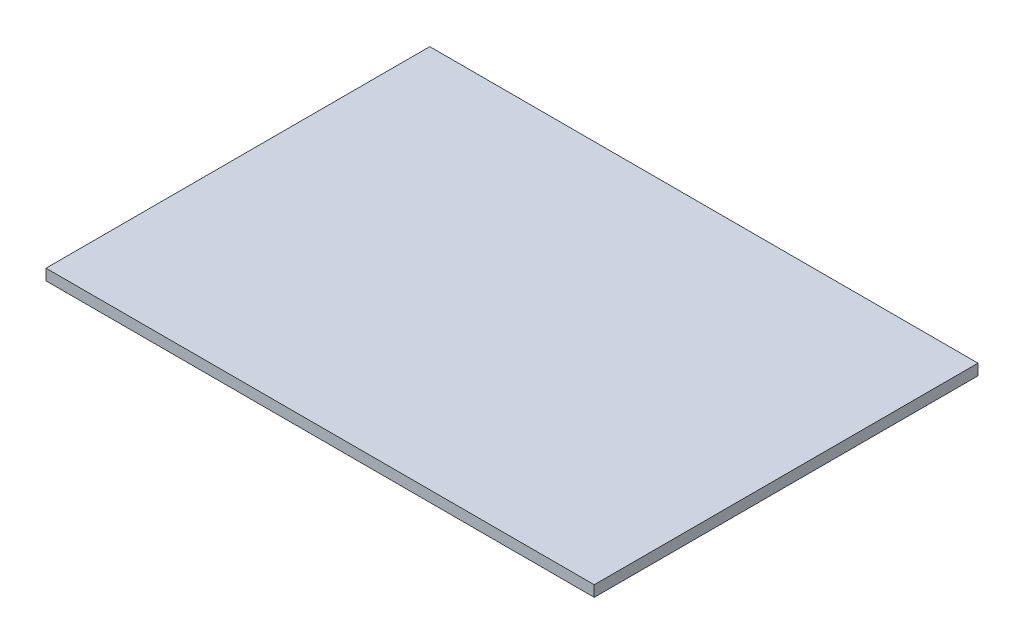
ISO-10303-21;
HEADER;
FILE_DESCRIPTION(('STEP AP214'),'2;1');
FILE_NAME('part.step','',(''),(''),'','','');
FILE_SCHEMA(('AUTOMOTIVE_DESIGN { 1 0 10303 214 1 1 1 1 }'));
ENDSEC;
DATA;
#1=APPLICATION_CONTEXT('core data for automotive mechanical design processes');
#2=APPLICATION_PROTOCOL_DEFINITION('international standard','automotive_design',2000,#1);
#3=PRODUCT_CONTEXT('',#1,'mechanical');
#4=PRODUCT('Part','Part','',(#3));
#5=PRODUCT_RELATED_PRODUCT_CATEGORY('part','',(#4));
#6=PRODUCT_DEFINITION_FORMATION('','',#4);
#7=PRODUCT_DEFINITION_CONTEXT('part definition',#1,'design');
#8=PRODUCT_DEFINITION('design','',#6,#7);
#9=PRODUCT_DEFINITION_SHAPE('','',#8);
#10=(LENGTH_UNIT() NAMED_UNIT(*) SI_UNIT(.MILLI.,.METRE.));
#11=(NAMED_UNIT(*) PLANE_ANGLE_UNIT() SI_UNIT($,.RADIAN.));
#12=(NAMED_UNIT(*) SI_UNIT($,.STERADIAN.) SOLID_ANGLE_UNIT());
#13=UNCERTAINTY_MEASURE_WITH_UNIT(LENGTH_MEASURE(1.E-05),#10,'distance_accuracy_value','');
#14=(GEOMETRIC_REPRESENTATION_CONTEXT(3) GLOBAL_UNCERTAINTY_ASSIGNED_CONTEXT((#13)) GLOBAL_UNIT_ASSIGNED_CONTEXT((#10,
#11,#12)) REPRESENTATION_CONTEXT('',''));
#15=CARTESIAN_POINT('',(0.,0.,0.));
#16=DIRECTION('',(0.,0.,1.));
#17=DIRECTION('',(1.,0.,0.));
#18=AXIS2_PLACEMENT_3D('',#15,#16,#17);
#19=CARTESIAN_POINT('',(-250.,10.,175.));
#20=DIRECTION('',(1.,0.,0.));
#21=DIRECTION('',(0.,0.,-1.));
#22=AXIS2_PLACEMENT_3D('',#19,#20,#21);
#23=PLANE('',#22);
#24=DIRECTION('',(0.,0.,1.));
#25=VECTOR('',#24,1.);
#26=CARTESIAN_POINT('',(-250.,0.,175.));
#27=LINE('',#26,#25);
#28=CARTESIAN_POINT('',(-250.,0.,-175.));
#29=VERTEX_POINT('',#28);
#30=CARTESIAN_POINT('',(-250.,0.,175.));
#31=VERTEX_POINT('',#30);
#32=EDGE_CURVE('E107',#29,#31,#27,.T.);
#33=ORIENTED_EDGE('',*,*,#32,.T.);
#34=DIRECTION('',(0.,-1.,0.));
#35=VECTOR('',#34,1.);
#36=CARTESIAN_POINT('',(-250.,10.,175.));
#37=LINE('',#36,#35);
#38=CARTESIAN_POINT('',(-250.,10.,175.));
#39=VERTEX_POINT('',#38);
#40=EDGE_CURVE('E11',#39,#31,#37,.T.);
#41=ORIENTED_EDGE('',*,*,#40,.F.);
#42=DIRECTION('',(0.,0.,1.));
#43=VECTOR('',#42,1.);
#44=CARTESIAN_POINT('',(-250.,10.,175.));
#45=LINE('',#44,#43);
#46=CARTESIAN_POINT('',(-250.,10.,-175.));
#47=VERTEX_POINT('',#46);
#48=EDGE_CURVE('E91',#47,#39,#45,.T.);
#49=ORIENTED_EDGE('',*,*,#48,.F.);
#50=DIRECTION('',(0.,-1.,0.));
#51=VECTOR('',#50,1.);
#52=CARTESIAN_POINT('',(-250.,10.,-175.));
#53=LINE('',#52,#51);
#54=EDGE_CURVE('E103',#47,#29,#53,.T.);
#55=ORIENTED_EDGE('',*,*,#54,.T.);
#56=EDGE_LOOP('',(#33,#41,#49,#55));
#57=FACE_BOUND('',#56,.T.);
#58=ADVANCED_FACE('F39',(#57),#23,.F.);
#59=CARTESIAN_POINT('',(250.,10.,175.));
#60=DIRECTION('',(0.,0.,-1.));
#61=DIRECTION('',(-1.,0.,0.));
#62=AXIS2_PLACEMENT_3D('',#59,#60,#61);
#63=PLANE('',#62);
#64=DIRECTION('',(1.,0.,0.));
#65=VECTOR('',#64,1.);
#66=CARTESIAN_POINT('',(250.,0.,175.));
#67=LINE('',#66,#65);
#68=CARTESIAN_POINT('',(250.,0.,175.));
#69=VERTEX_POINT('',#68);
#70=EDGE_CURVE('E96',#31,#69,#67,.T.);
#71=ORIENTED_EDGE('',*,*,#70,.T.);
#72=DIRECTION('',(0.,-1.,0.));
#73=VECTOR('',#72,1.);
#74=CARTESIAN_POINT('',(250.,10.,175.));
#75=LINE('',#74,#73);
#76=CARTESIAN_POINT('',(250.,10.,175.));
#77=VERTEX_POINT('',#76);
#78=EDGE_CURVE('E48',#77,#69,#75,.T.);
#79=ORIENTED_EDGE('',*,*,#78,.F.);
#80=DIRECTION('',(1.,0.,0.));
#81=VECTOR('',#80,1.);
#82=CARTESIAN_POINT('',(250.,10.,175.));
#83=LINE('',#82,#81);
#84=EDGE_CURVE('E86',#39,#77,#83,.T.);
#85=ORIENTED_EDGE('',*,*,#84,.F.);
#86=ORIENTED_EDGE('',*,*,#40,.T.);
#87=EDGE_LOOP('',(#71,#79,#85,#86));
#88=FACE_BOUND('',#87,.T.);
#89=ADVANCED_FACE('F95',(#88),#63,.F.);
#90=CARTESIAN_POINT('',(250.,10.,175.));
#91=DIRECTION('',(-1.,0.,0.));
#92=DIRECTION('',(0.,0.,1.));
#93=AXIS2_PLACEMENT_3D('',#90,#91,#92);
#94=PLANE('',#93);
#95=DIRECTION('',(0.,0.,-1.));
#96=VECTOR('',#95,1.);
#97=CARTESIAN_POINT('',(250.,0.,175.));
#98=LINE('',#97,#96);
#99=CARTESIAN_POINT('',(250.,0.,-175.));
#100=VERTEX_POINT('',#99);
#101=EDGE_CURVE('E73',#69,#100,#98,.T.);
#102=ORIENTED_EDGE('',*,*,#101,.T.);
#103=DIRECTION('',(0.,-1.,0.));
#104=VECTOR('',#103,1.);
#105=CARTESIAN_POINT('',(250.,10.,-175.));
#106=LINE('',#105,#104);
#107=CARTESIAN_POINT('',(250.,10.,-175.));
#108=VERTEX_POINT('',#107);
#109=EDGE_CURVE('E98',#108,#100,#106,.T.);
#110=ORIENTED_EDGE('',*,*,#109,.F.);
#111=DIRECTION('',(0.,0.,-1.));
#112=VECTOR('',#111,1.);
#113=CARTESIAN_POINT('',(250.,10.,175.));
#114=LINE('',#113,#112);
#115=EDGE_CURVE('E89',#77,#108,#114,.T.);
#116=ORIENTED_EDGE('',*,*,#115,.F.);
#117=ORIENTED_EDGE('',*,*,#78,.T.);
#118=EDGE_LOOP('',(#102,#110,#116,#117));
#119=FACE_BOUND('',#118,.T.);
#120=ADVANCED_FACE('F99',(#119),#94,.F.);
#121=CARTESIAN_POINT('',(250.,10.,-175.));
#122=DIRECTION('',(0.,0.,1.));
#123=DIRECTION('',(1.,0.,0.));
#124=AXIS2_PLACEMENT_3D('',#121,#122,#123);
#125=PLANE('',#124);
#126=DIRECTION('',(-1.,0.,0.));
#127=VECTOR('',#126,1.);
#128=CARTESIAN_POINT('',(250.,0.,-175.));
#129=LINE('',#128,#127);
#130=EDGE_CURVE('E79',#100,#29,#129,.T.);
#131=ORIENTED_EDGE('',*,*,#130,.T.);
#132=ORIENTED_EDGE('',*,*,#54,.F.);
#133=DIRECTION('',(-1.,0.,0.));
#134=VECTOR('',#133,1.);
#135=CARTESIAN_POINT('',(250.,10.,-175.));
#136=LINE('',#135,#134);
#137=EDGE_CURVE('E56',#108,#47,#136,.T.);
#138=ORIENTED_EDGE('',*,*,#137,.F.);
#139=ORIENTED_EDGE('',*,*,#109,.T.);
#140=EDGE_LOOP('',(#131,#132,#138,#139));
#141=FACE_BOUND('',#140,.T.);
#142=ADVANCED_FACE('F120',(#141),#125,.F.);
#143=CARTESIAN_POINT('',(0.,10.,0.));
#144=DIRECTION('',(0.,1.,0.));
#145=DIRECTION('',(0.,0.,1.));
#146=AXIS2_PLACEMENT_3D('',#143,#144,#145);
#147=PLANE('',#146);
#148=ORIENTED_EDGE('',*,*,#48,.T.);
#149=ORIENTED_EDGE('',*,*,#84,.T.);
#150=ORIENTED_EDGE('',*,*,#115,.T.);
#151=ORIENTED_EDGE('',*,*,#137,.T.);
#152=EDGE_LOOP('',(#148,#149,#150,#151));
#153=FACE_BOUND('',#152,.T.);
#154=ADVANCED_FACE('F87',(#153),#147,.T.);
#155=CARTESIAN_POINT('',(0.,0.,0.));
#156=DIRECTION('',(0.,1.,0.));
#157=DIRECTION('',(0.,0.,1.));
#158=AXIS2_PLACEMENT_3D('',#155,#156,#157);
#159=PLANE('',#158);
#160=ORIENTED_EDGE('',*,*,#32,.F.);
#161=ORIENTED_EDGE('',*,*,#130,.F.);
#162=ORIENTED_EDGE('',*,*,#101,.F.);
#163=ORIENTED_EDGE('',*,*,#70,.F.);
#164=EDGE_LOOP('',(#160,#161,#162,#163));
#165=FACE_BOUND('',#164,.T.);
#166=ADVANCED_FACE('F123',(#165),#159,.F.);
#167=CLOSED_SHELL('',(#58,#89,#120,#142,#154,#166));
#168=MANIFOLD_SOLID_BREP('B2',#167);
#169=ADVANCED_BREP_SHAPE_REPRESENTATION('',(#18,#168),#14);
#170=SHAPE_DEFINITION_REPRESENTATION(#9,#169);
ENDSEC;
END-ISO-10303-21;
